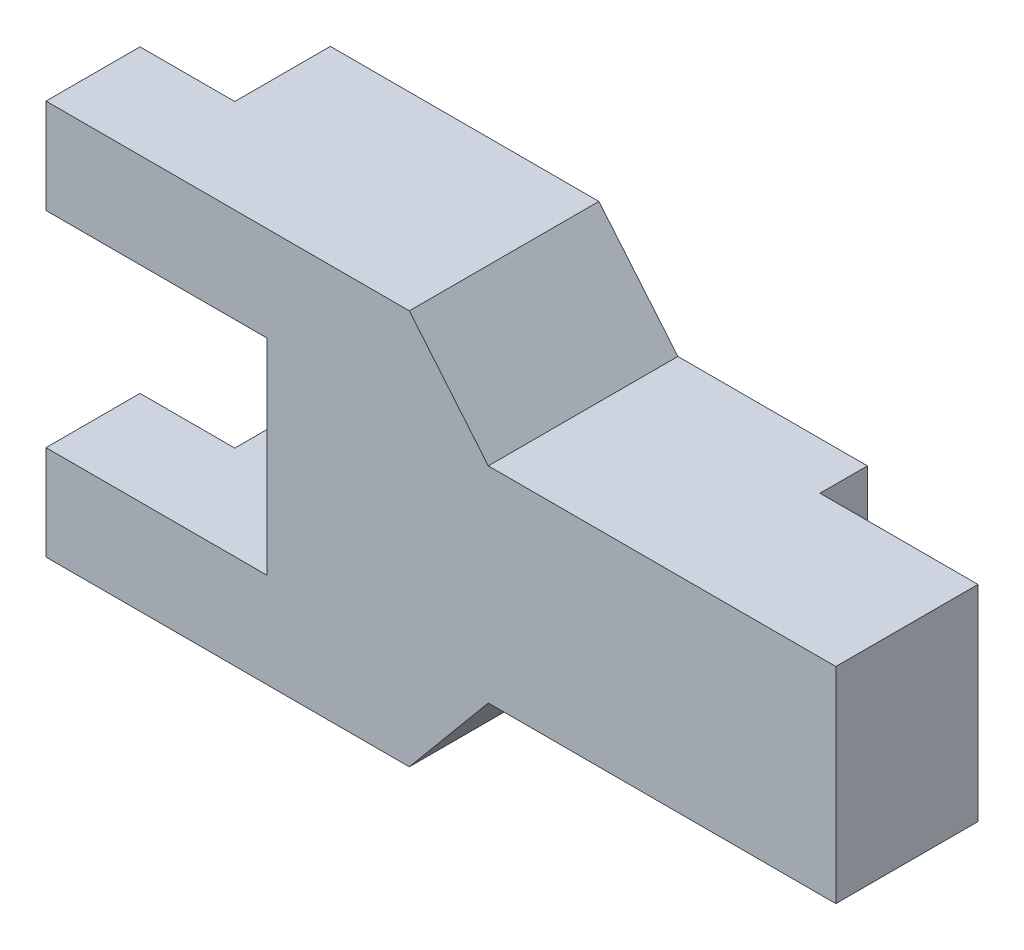
ISO-10303-21;
HEADER;
FILE_DESCRIPTION(('STEP AP214'),'2;1');
FILE_NAME('part.step','',(''),(''),'','','');
FILE_SCHEMA(('AUTOMOTIVE_DESIGN { 1 0 10303 214 1 1 1 1 }'));
ENDSEC;
DATA;
#1=APPLICATION_CONTEXT('core data for automotive mechanical design processes');
#2=APPLICATION_PROTOCOL_DEFINITION('international standard','automotive_design',2000,#1);
#3=PRODUCT_CONTEXT('',#1,'mechanical');
#4=PRODUCT('Part','Part','',(#3));
#5=PRODUCT_RELATED_PRODUCT_CATEGORY('part','',(#4));
#6=PRODUCT_DEFINITION_FORMATION('','',#4);
#7=PRODUCT_DEFINITION_CONTEXT('part definition',#1,'design');
#8=PRODUCT_DEFINITION('design','',#6,#7);
#9=PRODUCT_DEFINITION_SHAPE('','',#8);
#10=(LENGTH_UNIT() NAMED_UNIT(*) SI_UNIT(.MILLI.,.METRE.));
#11=(NAMED_UNIT(*) PLANE_ANGLE_UNIT() SI_UNIT($,.RADIAN.));
#12=(NAMED_UNIT(*) SI_UNIT($,.STERADIAN.) SOLID_ANGLE_UNIT());
#13=UNCERTAINTY_MEASURE_WITH_UNIT(LENGTH_MEASURE(1.E-05),#10,'distance_accuracy_value','');
#14=(GEOMETRIC_REPRESENTATION_CONTEXT(3) GLOBAL_UNCERTAINTY_ASSIGNED_CONTEXT((#13)) GLOBAL_UNIT_ASSIGNED_CONTEXT((#10,
#11,#12)) REPRESENTATION_CONTEXT('',''));
#15=CARTESIAN_POINT('',(0.,0.,0.));
#16=DIRECTION('',(0.,0.,1.));
#17=DIRECTION('',(1.,0.,0.));
#18=AXIS2_PLACEMENT_3D('',#15,#16,#17);
#19=CARTESIAN_POINT('',(-1654.77614905114,1083.80606669993,609.6));
#20=DIRECTION('',(0.,-1.,0.));
#21=DIRECTION('',(0.,0.,-1.));
#22=AXIS2_PLACEMENT_3D('',#19,#20,#21);
#23=PLANE('',#22);
#24=DIRECTION('',(0.,0.,-1.));
#25=VECTOR('',#24,1.);
#26=CARTESIAN_POINT('',(-2518.37614905114,1083.80606669993,307.34));
#27=LINE('',#26,#25);
#28=CARTESIAN_POINT('',(-2518.37614905114,1083.80606669993,307.34));
#29=VERTEX_POINT('',#28);
#30=CARTESIAN_POINT('',(-2518.37614905114,1083.80606669993,0.));
#31=VERTEX_POINT('',#30);
#32=EDGE_CURVE('E61',#29,#31,#27,.T.);
#33=ORIENTED_EDGE('',*,*,#32,.F.);
#34=DIRECTION('',(1.,0.,0.));
#35=VECTOR('',#34,1.);
#36=CARTESIAN_POINT('',(-2823.17614905114,1083.80606669993,307.34));
#37=LINE('',#36,#35);
#38=CARTESIAN_POINT('',(-2823.17614905114,1083.80606669993,307.34));
#39=VERTEX_POINT('',#38);
#40=EDGE_CURVE('E178',#39,#29,#37,.T.);
#41=ORIENTED_EDGE('',*,*,#40,.F.);
#42=DIRECTION('',(0.,0.,-1.));
#43=VECTOR('',#42,1.);
#44=CARTESIAN_POINT('',(-2823.17614905114,1083.80606669993,609.6));
#45=LINE('',#44,#43);
#46=CARTESIAN_POINT('',(-2823.17614905114,1083.80606669993,609.6));
#47=VERTEX_POINT('',#46);
#48=EDGE_CURVE('E346',#47,#39,#45,.T.);
#49=ORIENTED_EDGE('',*,*,#48,.F.);
#50=DIRECTION('',(-1.,0.,0.));
#51=VECTOR('',#50,1.);
#52=CARTESIAN_POINT('',(-1654.77614905114,1083.80606669993,609.6));
#53=LINE('',#52,#51);
#54=CARTESIAN_POINT('',(-1654.77614905114,1083.80606669993,609.6));
#55=VERTEX_POINT('',#54);
#56=EDGE_CURVE('E261',#55,#47,#53,.T.);
#57=ORIENTED_EDGE('',*,*,#56,.F.);
#58=DIRECTION('',(0.,0.,-1.));
#59=VECTOR('',#58,1.);
#60=CARTESIAN_POINT('',(-1654.77614905114,1083.80606669993,609.6));
#61=LINE('',#60,#59);
#62=CARTESIAN_POINT('',(-1654.77614905114,1083.80606669993,0.));
#63=VERTEX_POINT('',#62);
#64=EDGE_CURVE('E349',#55,#63,#61,.T.);
#65=ORIENTED_EDGE('',*,*,#64,.T.);
#66=DIRECTION('',(-1.,0.,0.));
#67=VECTOR('',#66,1.);
#68=CARTESIAN_POINT('',(-1654.77614905114,1083.80606669993,0.));
#69=LINE('',#68,#67);
#70=EDGE_CURVE('E193',#63,#31,#69,.T.);
#71=ORIENTED_EDGE('',*,*,#70,.T.);
#72=EDGE_LOOP('',(#33,#41,#49,#57,#65,#71));
#73=FACE_BOUND('',#72,.T.);
#74=ADVANCED_FACE('F45',(#73),#23,.F.);
#75=CARTESIAN_POINT('',(-2823.17614905114,779.006066699927,609.6));
#76=DIRECTION('',(0.,1.,0.));
#77=DIRECTION('',(-1.,0.,0.));
#78=AXIS2_PLACEMENT_3D('',#75,#76,#77);
#79=PLANE('',#78);
#80=DIRECTION('',(0.,0.,-1.));
#81=VECTOR('',#80,1.);
#82=CARTESIAN_POINT('',(-2518.37614905114,779.006066699927,307.34));
#83=LINE('',#82,#81);
#84=CARTESIAN_POINT('',(-2518.37614905114,779.006066699927,307.34));
#85=VERTEX_POINT('',#84);
#86=CARTESIAN_POINT('',(-2518.37614905114,779.006066699927,0.));
#87=VERTEX_POINT('',#86);
#88=EDGE_CURVE('E173',#85,#87,#83,.T.);
#89=ORIENTED_EDGE('',*,*,#88,.T.);
#90=DIRECTION('',(1.,0.,0.));
#91=VECTOR('',#90,1.);
#92=CARTESIAN_POINT('',(-2823.17614905114,779.006066699927,0.));
#93=LINE('',#92,#91);
#94=CARTESIAN_POINT('',(-2111.97614905114,779.006066699927,0.));
#95=VERTEX_POINT('',#94);
#96=EDGE_CURVE('E296',#87,#95,#93,.T.);
#97=ORIENTED_EDGE('',*,*,#96,.T.);
#98=DIRECTION('',(0.,0.,-1.));
#99=VECTOR('',#98,1.);
#100=CARTESIAN_POINT('',(-2111.97614905114,779.006066699927,609.6));
#101=LINE('',#100,#99);
#102=CARTESIAN_POINT('',(-2111.97614905114,779.006066699927,609.6));
#103=VERTEX_POINT('',#102);
#104=EDGE_CURVE('E338',#103,#95,#101,.T.);
#105=ORIENTED_EDGE('',*,*,#104,.F.);
#106=DIRECTION('',(1.,0.,0.));
#107=VECTOR('',#106,1.);
#108=CARTESIAN_POINT('',(-2823.17614905114,779.006066699927,609.6));
#109=LINE('',#108,#107);
#110=CARTESIAN_POINT('',(-2823.17614905114,779.006066699927,609.6));
#111=VERTEX_POINT('',#110);
#112=EDGE_CURVE('E267',#111,#103,#109,.T.);
#113=ORIENTED_EDGE('',*,*,#112,.F.);
#114=DIRECTION('',(0.,0.,-1.));
#115=VECTOR('',#114,1.);
#116=CARTESIAN_POINT('',(-2823.17614905114,779.006066699927,609.6));
#117=LINE('',#116,#115);
#118=CARTESIAN_POINT('',(-2823.17614905114,779.006066699927,307.34));
#119=VERTEX_POINT('',#118);
#120=EDGE_CURVE('E342',#111,#119,#117,.T.);
#121=ORIENTED_EDGE('',*,*,#120,.T.);
#122=DIRECTION('',(1.,0.,0.));
#123=VECTOR('',#122,1.);
#124=CARTESIAN_POINT('',(-2823.17614905114,779.006066699927,307.34));
#125=LINE('',#124,#123);
#126=EDGE_CURVE('E177',#119,#85,#125,.T.);
#127=ORIENTED_EDGE('',*,*,#126,.T.);
#128=EDGE_LOOP('',(#89,#97,#105,#113,#121,#127));
#129=FACE_BOUND('',#128,.T.);
#130=ADVANCED_FACE('F370',(#129),#79,.F.);
#131=CARTESIAN_POINT('',(-2111.97614905114,118.606066699927,609.6));
#132=DIRECTION('',(0.,-1.,0.));
#133=DIRECTION('',(1.,0.,0.));
#134=AXIS2_PLACEMENT_3D('',#131,#132,#133);
#135=PLANE('',#134);
#136=DIRECTION('',(0.,0.,-1.));
#137=VECTOR('',#136,1.);
#138=CARTESIAN_POINT('',(-2518.37614905114,118.606066699927,307.34));
#139=LINE('',#138,#137);
#140=CARTESIAN_POINT('',(-2518.37614905114,118.606066699927,307.34));
#141=VERTEX_POINT('',#140);
#142=CARTESIAN_POINT('',(-2518.37614905114,118.606066699927,0.));
#143=VERTEX_POINT('',#142);
#144=EDGE_CURVE('E69',#141,#143,#139,.T.);
#145=ORIENTED_EDGE('',*,*,#144,.F.);
#146=DIRECTION('',(1.,0.,0.));
#147=VECTOR('',#146,1.);
#148=CARTESIAN_POINT('',(-2823.17614905114,118.606066699927,307.34));
#149=LINE('',#148,#147);
#150=CARTESIAN_POINT('',(-2823.17614905114,118.606066699927,307.34));
#151=VERTEX_POINT('',#150);
#152=EDGE_CURVE('E213',#151,#141,#149,.T.);
#153=ORIENTED_EDGE('',*,*,#152,.F.);
#154=DIRECTION('',(0.,0.,-1.));
#155=VECTOR('',#154,1.);
#156=CARTESIAN_POINT('',(-2823.17614905114,118.606066699927,609.6));
#157=LINE('',#156,#155);
#158=CARTESIAN_POINT('',(-2823.17614905114,118.606066699927,609.6));
#159=VERTEX_POINT('',#158);
#160=EDGE_CURVE('E330',#159,#151,#157,.T.);
#161=ORIENTED_EDGE('',*,*,#160,.F.);
#162=DIRECTION('',(-1.,0.,0.));
#163=VECTOR('',#162,1.);
#164=CARTESIAN_POINT('',(-2111.97614905114,118.606066699927,609.6));
#165=LINE('',#164,#163);
#166=CARTESIAN_POINT('',(-2111.97614905114,118.606066699927,609.6));
#167=VERTEX_POINT('',#166);
#168=EDGE_CURVE('E273',#167,#159,#165,.T.);
#169=ORIENTED_EDGE('',*,*,#168,.F.);
#170=DIRECTION('',(0.,0.,-1.));
#171=VECTOR('',#170,1.);
#172=CARTESIAN_POINT('',(-2111.97614905114,118.606066699927,609.6));
#173=LINE('',#172,#171);
#174=CARTESIAN_POINT('',(-2111.97614905114,118.606066699927,0.));
#175=VERTEX_POINT('',#174);
#176=EDGE_CURVE('E334',#167,#175,#173,.T.);
#177=ORIENTED_EDGE('',*,*,#176,.T.);
#178=DIRECTION('',(-1.,0.,0.));
#179=VECTOR('',#178,1.);
#180=CARTESIAN_POINT('',(-2111.97614905114,118.606066699927,0.));
#181=LINE('',#180,#179);
#182=EDGE_CURVE('E302',#175,#143,#181,.T.);
#183=ORIENTED_EDGE('',*,*,#182,.T.);
#184=EDGE_LOOP('',(#145,#153,#161,#169,#177,#183));
#185=FACE_BOUND('',#184,.T.);
#186=ADVANCED_FACE('F416',(#185),#135,.F.);
#187=CARTESIAN_POINT('',(-2823.17614905114,-186.193933300073,609.6));
#188=DIRECTION('',(0.,1.,0.));
#189=DIRECTION('',(-1.,0.,0.));
#190=AXIS2_PLACEMENT_3D('',#187,#188,#189);
#191=PLANE('',#190);
#192=DIRECTION('',(0.,0.,-1.));
#193=VECTOR('',#192,1.);
#194=CARTESIAN_POINT('',(-2518.37614905114,-186.193933300073,307.34));
#195=LINE('',#194,#193);
#196=CARTESIAN_POINT('',(-2518.37614905114,-186.193933300073,307.34));
#197=VERTEX_POINT('',#196);
#198=CARTESIAN_POINT('',(-2518.37614905114,-186.193933300073,0.));
#199=VERTEX_POINT('',#198);
#200=EDGE_CURVE('E206',#197,#199,#195,.T.);
#201=ORIENTED_EDGE('',*,*,#200,.T.);
#202=DIRECTION('',(1.,0.,0.));
#203=VECTOR('',#202,1.);
#204=CARTESIAN_POINT('',(-2823.17614905114,-186.193933300073,0.));
#205=LINE('',#204,#203);
#206=CARTESIAN_POINT('',(-1654.77614905114,-186.193933300073,0.));
#207=VERTEX_POINT('',#206);
#208=EDGE_CURVE('E306',#199,#207,#205,.T.);
#209=ORIENTED_EDGE('',*,*,#208,.T.);
#210=DIRECTION('',(0.,0.,-1.));
#211=VECTOR('',#210,1.);
#212=CARTESIAN_POINT('',(-1654.77614905114,-186.193933300073,609.6));
#213=LINE('',#212,#211);
#214=CARTESIAN_POINT('',(-1654.77614905114,-186.193933300073,609.6));
#215=VERTEX_POINT('',#214);
#216=EDGE_CURVE('E322',#215,#207,#213,.T.);
#217=ORIENTED_EDGE('',*,*,#216,.F.);
#218=DIRECTION('',(1.,0.,0.));
#219=VECTOR('',#218,1.);
#220=CARTESIAN_POINT('',(-2823.17614905114,-186.193933300073,609.6));
#221=LINE('',#220,#219);
#222=CARTESIAN_POINT('',(-2823.17614905114,-186.193933300073,609.6));
#223=VERTEX_POINT('',#222);
#224=EDGE_CURVE('E279',#223,#215,#221,.T.);
#225=ORIENTED_EDGE('',*,*,#224,.F.);
#226=DIRECTION('',(0.,0.,-1.));
#227=VECTOR('',#226,1.);
#228=CARTESIAN_POINT('',(-2823.17614905114,-186.193933300073,609.6));
#229=LINE('',#228,#227);
#230=CARTESIAN_POINT('',(-2823.17614905114,-186.193933300073,307.34));
#231=VERTEX_POINT('',#230);
#232=EDGE_CURVE('E326',#223,#231,#229,.T.);
#233=ORIENTED_EDGE('',*,*,#232,.T.);
#234=DIRECTION('',(1.,0.,0.));
#235=VECTOR('',#234,1.);
#236=CARTESIAN_POINT('',(-2823.17614905114,-186.193933300073,307.34));
#237=LINE('',#236,#235);
#238=EDGE_CURVE('E216',#231,#197,#237,.T.);
#239=ORIENTED_EDGE('',*,*,#238,.T.);
#240=EDGE_LOOP('',(#201,#209,#217,#225,#233,#239));
#241=FACE_BOUND('',#240,.T.);
#242=ADVANCED_FACE('F407',(#241),#191,.F.);
#243=CARTESIAN_POINT('',(0.,0.,0.));
#244=DIRECTION('',(0.,0.,1.));
#245=DIRECTION('',(1.,0.,0.));
#246=AXIS2_PLACEMENT_3D('',#243,#244,#245);
#247=PLANE('',#246);
#248=DIRECTION('',(0.,1.,0.));
#249=VECTOR('',#248,1.);
#250=CARTESIAN_POINT('',(-2518.37614905114,779.006066699927,0.));
#251=LINE('',#250,#249);
#252=EDGE_CURVE('E188',#87,#31,#251,.T.);
#253=ORIENTED_EDGE('',*,*,#252,.T.);
#254=ORIENTED_EDGE('',*,*,#70,.F.);
#255=DIRECTION('',(-0.640184399664479,0.768221279597377,0.));
#256=VECTOR('',#255,1.);
#257=CARTESIAN_POINT('',(-1400.77614905114,779.006066699928,0.));
#258=LINE('',#257,#256);
#259=CARTESIAN_POINT('',(-1400.77614905114,779.006066699928,0.));
#260=VERTEX_POINT('',#259);
#261=EDGE_CURVE('E291',#260,#63,#258,.T.);
#262=ORIENTED_EDGE('',*,*,#261,.F.);
#263=DIRECTION('',(-1.,0.,0.));
#264=VECTOR('',#263,1.);
#265=CARTESIAN_POINT('',(-283.176149051143,779.006066699928,0.));
#266=LINE('',#265,#264);
#267=CARTESIAN_POINT('',(-791.176149051142,779.006066699928,0.));
#268=VERTEX_POINT('',#267);
#269=EDGE_CURVE('E247',#268,#260,#266,.T.);
#270=ORIENTED_EDGE('',*,*,#269,.F.);
#271=DIRECTION('',(0.,1.,0.));
#272=VECTOR('',#271,1.);
#273=CARTESIAN_POINT('',(-791.176149051142,779.006066699928,0.));
#274=LINE('',#273,#272);
#275=CARTESIAN_POINT('',(-791.176149051143,118.606066699928,0.));
#276=VERTEX_POINT('',#275);
#277=EDGE_CURVE('E198',#276,#268,#274,.T.);
#278=ORIENTED_EDGE('',*,*,#277,.F.);
#279=DIRECTION('',(1.,0.,0.));
#280=VECTOR('',#279,1.);
#281=CARTESIAN_POINT('',(-1400.77614905114,118.606066699928,0.));
#282=LINE('',#281,#280);
#283=CARTESIAN_POINT('',(-1400.77614905114,118.606066699928,0.));
#284=VERTEX_POINT('',#283);
#285=EDGE_CURVE('E255',#284,#276,#282,.T.);
#286=ORIENTED_EDGE('',*,*,#285,.F.);
#287=DIRECTION('',(0.640184399664479,0.768221279597377,0.));
#288=VECTOR('',#287,1.);
#289=CARTESIAN_POINT('',(-1654.77614905114,-186.193933300073,0.));
#290=LINE('',#289,#288);
#291=EDGE_CURVE('E309',#207,#284,#290,.T.);
#292=ORIENTED_EDGE('',*,*,#291,.F.);
#293=ORIENTED_EDGE('',*,*,#208,.F.);
#294=DIRECTION('',(0.,1.,0.));
#295=VECTOR('',#294,1.);
#296=CARTESIAN_POINT('',(-2518.37614905114,-186.193933300073,0.));
#297=LINE('',#296,#295);
#298=EDGE_CURVE('E210',#199,#143,#297,.T.);
#299=ORIENTED_EDGE('',*,*,#298,.T.);
#300=ORIENTED_EDGE('',*,*,#182,.F.);
#301=DIRECTION('',(0.,-1.,0.));
#302=VECTOR('',#301,1.);
#303=CARTESIAN_POINT('',(-2111.97614905114,779.006066699927,0.));
#304=LINE('',#303,#302);
#305=EDGE_CURVE('E299',#95,#175,#304,.T.);
#306=ORIENTED_EDGE('',*,*,#305,.F.);
#307=ORIENTED_EDGE('',*,*,#96,.F.);
#308=EDGE_LOOP('',(#253,#254,#262,#270,#278,#286,#292,#293,#299,#300,#306,#307));
#309=FACE_BOUND('',#308,.T.);
#310=ADVANCED_FACE('F362',(#309),#247,.F.);
#311=CARTESIAN_POINT('',(-283.176149051143,118.606066699928,609.6));
#312=DIRECTION('',(-1.,0.,0.));
#313=DIRECTION('',(0.,0.,1.));
#314=AXIS2_PLACEMENT_3D('',#311,#312,#313);
#315=PLANE('',#314);
#316=DIRECTION('',(0.,-1.,0.));
#317=VECTOR('',#316,1.);
#318=CARTESIAN_POINT('',(-283.176149051143,779.006066699928,152.4));
#319=LINE('',#318,#317);
#320=CARTESIAN_POINT('',(-283.176149051143,779.006066699928,152.4));
#321=VERTEX_POINT('',#320);
#322=CARTESIAN_POINT('',(-283.176149051143,118.606066699928,152.4));
#323=VERTEX_POINT('',#322);
#324=EDGE_CURVE('E226',#321,#323,#319,.T.);
#325=ORIENTED_EDGE('',*,*,#324,.F.);
#326=DIRECTION('',(0.,0.,-1.));
#327=VECTOR('',#326,1.);
#328=CARTESIAN_POINT('',(-283.176149051143,779.006066699928,609.6));
#329=LINE('',#328,#327);
#330=CARTESIAN_POINT('',(-283.176149051143,779.006066699928,609.6));
#331=VERTEX_POINT('',#330);
#332=EDGE_CURVE('E11',#331,#321,#329,.T.);
#333=ORIENTED_EDGE('',*,*,#332,.F.);
#334=DIRECTION('',(0.,1.,0.));
#335=VECTOR('',#334,1.);
#336=CARTESIAN_POINT('',(-283.176149051143,118.606066699928,609.6));
#337=LINE('',#336,#335);
#338=CARTESIAN_POINT('',(-283.176149051143,118.606066699928,609.6));
#339=VERTEX_POINT('',#338);
#340=EDGE_CURVE('E250',#339,#331,#337,.T.);
#341=ORIENTED_EDGE('',*,*,#340,.F.);
#342=DIRECTION('',(0.,0.,-1.));
#343=VECTOR('',#342,1.);
#344=CARTESIAN_POINT('',(-283.176149051143,118.606066699928,609.6));
#345=LINE('',#344,#343);
#346=EDGE_CURVE('E288',#339,#323,#345,.T.);
#347=ORIENTED_EDGE('',*,*,#346,.T.);
#348=EDGE_LOOP('',(#325,#333,#341,#347));
#349=FACE_BOUND('',#348,.T.);
#350=ADVANCED_FACE('F47',(#349),#315,.F.);
#351=CARTESIAN_POINT('',(-283.176149051143,779.006066699928,609.6));
#352=DIRECTION('',(0.,-1.,0.));
#353=DIRECTION('',(1.,0.,0.));
#354=AXIS2_PLACEMENT_3D('',#351,#352,#353);
#355=PLANE('',#354);
#356=DIRECTION('',(1.,0.,0.));
#357=VECTOR('',#356,1.);
#358=CARTESIAN_POINT('',(-283.176149051143,779.006066699928,152.4));
#359=LINE('',#358,#357);
#360=CARTESIAN_POINT('',(-791.176149051142,779.006066699928,152.4));
#361=VERTEX_POINT('',#360);
#362=EDGE_CURVE('E237',#361,#321,#359,.T.);
#363=ORIENTED_EDGE('',*,*,#362,.F.);
#364=DIRECTION('',(0.,0.,-1.));
#365=VECTOR('',#364,1.);
#366=CARTESIAN_POINT('',(-791.176149051142,779.006066699928,152.4));
#367=LINE('',#366,#365);
#368=EDGE_CURVE('E243',#361,#268,#367,.T.);
#369=ORIENTED_EDGE('',*,*,#368,.T.);
#370=ORIENTED_EDGE('',*,*,#269,.T.);
#371=DIRECTION('',(0.,0.,-1.));
#372=VECTOR('',#371,1.);
#373=CARTESIAN_POINT('',(-1400.77614905114,779.006066699928,609.6));
#374=LINE('',#373,#372);
#375=CARTESIAN_POINT('',(-1400.77614905114,779.006066699928,609.6));
#376=VERTEX_POINT('',#375);
#377=EDGE_CURVE('E54',#376,#260,#374,.T.);
#378=ORIENTED_EDGE('',*,*,#377,.F.);
#379=DIRECTION('',(-1.,0.,0.));
#380=VECTOR('',#379,1.);
#381=CARTESIAN_POINT('',(-283.176149051143,779.006066699928,609.6));
#382=LINE('',#381,#380);
#383=EDGE_CURVE('E254',#331,#376,#382,.T.);
#384=ORIENTED_EDGE('',*,*,#383,.F.);
#385=ORIENTED_EDGE('',*,*,#332,.T.);
#386=EDGE_LOOP('',(#363,#369,#370,#378,#384,#385));
#387=FACE_BOUND('',#386,.T.);
#388=ADVANCED_FACE('F382',(#387),#355,.F.);
#389=CARTESIAN_POINT('',(-1400.77614905114,779.006066699928,609.6));
#390=DIRECTION('',(-0.768221279597377,-0.640184399664479,0.));
#391=DIRECTION('',(0.640184399664479,-0.768221279597377,0.));
#392=AXIS2_PLACEMENT_3D('',#389,#390,#391);
#393=PLANE('',#392);
#394=ORIENTED_EDGE('',*,*,#261,.T.);
#395=ORIENTED_EDGE('',*,*,#64,.F.);
#396=DIRECTION('',(-0.640184399664479,0.768221279597377,0.));
#397=VECTOR('',#396,1.);
#398=CARTESIAN_POINT('',(-1400.77614905114,779.006066699928,609.6));
#399=LINE('',#398,#397);
#400=EDGE_CURVE('E258',#376,#55,#399,.T.);
#401=ORIENTED_EDGE('',*,*,#400,.F.);
#402=ORIENTED_EDGE('',*,*,#377,.T.);
#403=EDGE_LOOP('',(#394,#395,#401,#402));
#404=FACE_BOUND('',#403,.T.);
#405=ADVANCED_FACE('F357',(#404),#393,.F.);
#406=CARTESIAN_POINT('',(-2823.17614905114,1083.80606669993,609.6));
#407=DIRECTION('',(1.,0.,0.));
#408=DIRECTION('',(0.,1.,0.));
#409=AXIS2_PLACEMENT_3D('',#406,#407,#408);
#410=PLANE('',#409);
#411=ORIENTED_EDGE('',*,*,#48,.T.);
#412=DIRECTION('',(0.,1.,0.));
#413=VECTOR('',#412,1.);
#414=CARTESIAN_POINT('',(-2823.17614905114,779.006066699927,307.34));
#415=LINE('',#414,#413);
#416=EDGE_CURVE('E183',#119,#39,#415,.T.);
#417=ORIENTED_EDGE('',*,*,#416,.F.);
#418=ORIENTED_EDGE('',*,*,#120,.F.);
#419=DIRECTION('',(0.,-1.,0.));
#420=VECTOR('',#419,1.);
#421=CARTESIAN_POINT('',(-2823.17614905114,1083.80606669993,609.6));
#422=LINE('',#421,#420);
#423=EDGE_CURVE('E264',#47,#111,#422,.T.);
#424=ORIENTED_EDGE('',*,*,#423,.F.);
#425=EDGE_LOOP('',(#411,#417,#418,#424));
#426=FACE_BOUND('',#425,.T.);
#427=ADVANCED_FACE('F374',(#426),#410,.F.);
#428=CARTESIAN_POINT('',(-2111.97614905114,779.006066699927,609.6));
#429=DIRECTION('',(1.,0.,0.));
#430=DIRECTION('',(0.,0.,-1.));
#431=AXIS2_PLACEMENT_3D('',#428,#429,#430);
#432=PLANE('',#431);
#433=ORIENTED_EDGE('',*,*,#305,.T.);
#434=ORIENTED_EDGE('',*,*,#176,.F.);
#435=DIRECTION('',(0.,-1.,0.));
#436=VECTOR('',#435,1.);
#437=CARTESIAN_POINT('',(-2111.97614905114,779.006066699927,609.6));
#438=LINE('',#437,#436);
#439=EDGE_CURVE('E270',#103,#167,#438,.T.);
#440=ORIENTED_EDGE('',*,*,#439,.F.);
#441=ORIENTED_EDGE('',*,*,#104,.T.);
#442=EDGE_LOOP('',(#433,#434,#440,#441));
#443=FACE_BOUND('',#442,.T.);
#444=ADVANCED_FACE('F421',(#443),#432,.F.);
#445=CARTESIAN_POINT('',(-2823.17614905114,118.606066699927,609.6));
#446=DIRECTION('',(1.,0.,0.));
#447=DIRECTION('',(0.,1.,0.));
#448=AXIS2_PLACEMENT_3D('',#445,#446,#447);
#449=PLANE('',#448);
#450=ORIENTED_EDGE('',*,*,#160,.T.);
#451=DIRECTION('',(0.,1.,0.));
#452=VECTOR('',#451,1.);
#453=CARTESIAN_POINT('',(-2823.17614905114,-186.193933300073,307.34));
#454=LINE('',#453,#452);
#455=EDGE_CURVE('E205',#231,#151,#454,.T.);
#456=ORIENTED_EDGE('',*,*,#455,.F.);
#457=ORIENTED_EDGE('',*,*,#232,.F.);
#458=DIRECTION('',(0.,-1.,0.));
#459=VECTOR('',#458,1.);
#460=CARTESIAN_POINT('',(-2823.17614905114,118.606066699927,609.6));
#461=LINE('',#460,#459);
#462=EDGE_CURVE('E276',#159,#223,#461,.T.);
#463=ORIENTED_EDGE('',*,*,#462,.F.);
#464=EDGE_LOOP('',(#450,#456,#457,#463));
#465=FACE_BOUND('',#464,.T.);
#466=ADVANCED_FACE('F425',(#465),#449,.F.);
#467=CARTESIAN_POINT('',(-1654.77614905114,-186.193933300073,609.6));
#468=DIRECTION('',(-0.768221279597377,0.640184399664479,0.));
#469=DIRECTION('',(-0.640184399664479,-0.768221279597377,0.));
#470=AXIS2_PLACEMENT_3D('',#467,#468,#469);
#471=PLANE('',#470);
#472=ORIENTED_EDGE('',*,*,#291,.T.);
#473=DIRECTION('',(0.,0.,-1.));
#474=VECTOR('',#473,1.);
#475=CARTESIAN_POINT('',(-1400.77614905114,118.606066699928,609.6));
#476=LINE('',#475,#474);
#477=CARTESIAN_POINT('',(-1400.77614905114,118.606066699928,609.6));
#478=VERTEX_POINT('',#477);
#479=EDGE_CURVE('E318',#478,#284,#476,.T.);
#480=ORIENTED_EDGE('',*,*,#479,.F.);
#481=DIRECTION('',(0.640184399664479,0.768221279597377,0.));
#482=VECTOR('',#481,1.);
#483=CARTESIAN_POINT('',(-1654.77614905114,-186.193933300073,609.6));
#484=LINE('',#483,#482);
#485=EDGE_CURVE('E282',#215,#478,#484,.T.);
#486=ORIENTED_EDGE('',*,*,#485,.F.);
#487=ORIENTED_EDGE('',*,*,#216,.T.);
#488=EDGE_LOOP('',(#472,#480,#486,#487));
#489=FACE_BOUND('',#488,.T.);
#490=ADVANCED_FACE('F400',(#489),#471,.F.);
#491=CARTESIAN_POINT('',(-1400.77614905114,118.606066699928,609.6));
#492=DIRECTION('',(0.,1.,0.));
#493=DIRECTION('',(0.,0.,1.));
#494=AXIS2_PLACEMENT_3D('',#491,#492,#493);
#495=PLANE('',#494);
#496=ORIENTED_EDGE('',*,*,#285,.T.);
#497=DIRECTION('',(0.,0.,-1.));
#498=VECTOR('',#497,1.);
#499=CARTESIAN_POINT('',(-791.176149051143,118.606066699928,152.4));
#500=LINE('',#499,#498);
#501=CARTESIAN_POINT('',(-791.176149051143,118.606066699928,152.4));
#502=VERTEX_POINT('',#501);
#503=EDGE_CURVE('E240',#502,#276,#500,.T.);
#504=ORIENTED_EDGE('',*,*,#503,.F.);
#505=DIRECTION('',(-1.,0.,0.));
#506=VECTOR('',#505,1.);
#507=CARTESIAN_POINT('',(-283.176149051143,118.606066699928,152.4));
#508=LINE('',#507,#506);
#509=EDGE_CURVE('E229',#323,#502,#508,.T.);
#510=ORIENTED_EDGE('',*,*,#509,.F.);
#511=ORIENTED_EDGE('',*,*,#346,.F.);
#512=DIRECTION('',(1.,0.,0.));
#513=VECTOR('',#512,1.);
#514=CARTESIAN_POINT('',(-1400.77614905114,118.606066699928,609.6));
#515=LINE('',#514,#513);
#516=EDGE_CURVE('E285',#478,#339,#515,.T.);
#517=ORIENTED_EDGE('',*,*,#516,.F.);
#518=ORIENTED_EDGE('',*,*,#479,.T.);
#519=EDGE_LOOP('',(#496,#504,#510,#511,#517,#518));
#520=FACE_BOUND('',#519,.T.);
#521=ADVANCED_FACE('F391',(#520),#495,.F.);
#522=CARTESIAN_POINT('',(0.,0.,609.6));
#523=DIRECTION('',(0.,0.,1.));
#524=DIRECTION('',(1.,0.,0.));
#525=AXIS2_PLACEMENT_3D('',#522,#523,#524);
#526=PLANE('',#525);
#527=ORIENTED_EDGE('',*,*,#340,.T.);
#528=ORIENTED_EDGE('',*,*,#383,.T.);
#529=ORIENTED_EDGE('',*,*,#400,.T.);
#530=ORIENTED_EDGE('',*,*,#56,.T.);
#531=ORIENTED_EDGE('',*,*,#423,.T.);
#532=ORIENTED_EDGE('',*,*,#112,.T.);
#533=ORIENTED_EDGE('',*,*,#439,.T.);
#534=ORIENTED_EDGE('',*,*,#168,.T.);
#535=ORIENTED_EDGE('',*,*,#462,.T.);
#536=ORIENTED_EDGE('',*,*,#224,.T.);
#537=ORIENTED_EDGE('',*,*,#485,.T.);
#538=ORIENTED_EDGE('',*,*,#516,.T.);
#539=EDGE_LOOP('',(#527,#528,#529,#530,#531,#532,#533,#534,#535,#536,#537,#538));
#540=FACE_BOUND('',#539,.T.);
#541=ADVANCED_FACE('F378',(#540),#526,.T.);
#542=CARTESIAN_POINT('',(-791.176149051142,779.006066699928,152.4));
#543=DIRECTION('',(-1.,0.,0.));
#544=DIRECTION('',(0.,-1.,0.));
#545=AXIS2_PLACEMENT_3D('',#542,#543,#544);
#546=PLANE('',#545);
#547=ORIENTED_EDGE('',*,*,#277,.T.);
#548=ORIENTED_EDGE('',*,*,#368,.F.);
#549=DIRECTION('',(0.,1.,0.));
#550=VECTOR('',#549,1.);
#551=CARTESIAN_POINT('',(-791.176149051142,779.006066699928,152.4));
#552=LINE('',#551,#550);
#553=EDGE_CURVE('E233',#502,#361,#552,.T.);
#554=ORIENTED_EDGE('',*,*,#553,.F.);
#555=ORIENTED_EDGE('',*,*,#503,.T.);
#556=EDGE_LOOP('',(#547,#548,#554,#555));
#557=FACE_BOUND('',#556,.T.);
#558=ADVANCED_FACE('F395',(#557),#546,.F.);
#559=CARTESIAN_POINT('',(0.,0.,152.4));
#560=DIRECTION('',(0.,0.,-1.));
#561=DIRECTION('',(-1.,0.,0.));
#562=AXIS2_PLACEMENT_3D('',#559,#560,#561);
#563=PLANE('',#562);
#564=ORIENTED_EDGE('',*,*,#324,.T.);
#565=ORIENTED_EDGE('',*,*,#509,.T.);
#566=ORIENTED_EDGE('',*,*,#553,.T.);
#567=ORIENTED_EDGE('',*,*,#362,.T.);
#568=EDGE_LOOP('',(#564,#565,#566,#567));
#569=FACE_BOUND('',#568,.T.);
#570=ADVANCED_FACE('F388',(#569),#563,.T.);
#571=CARTESIAN_POINT('',(-2518.37614905114,-186.193933300073,307.34));
#572=DIRECTION('',(-1.,0.,0.));
#573=DIRECTION('',(0.,0.,1.));
#574=AXIS2_PLACEMENT_3D('',#571,#572,#573);
#575=PLANE('',#574);
#576=ORIENTED_EDGE('',*,*,#298,.F.);
#577=ORIENTED_EDGE('',*,*,#200,.F.);
#578=DIRECTION('',(0.,1.,0.));
#579=VECTOR('',#578,1.);
#580=CARTESIAN_POINT('',(-2518.37614905114,-186.193933300073,307.34));
#581=LINE('',#580,#579);
#582=EDGE_CURVE('E220',#197,#141,#581,.T.);
#583=ORIENTED_EDGE('',*,*,#582,.T.);
#584=ORIENTED_EDGE('',*,*,#144,.T.);
#585=EDGE_LOOP('',(#576,#577,#583,#584));
#586=FACE_BOUND('',#585,.T.);
#587=ADVANCED_FACE('F409',(#586),#575,.T.);
#588=CARTESIAN_POINT('',(0.,0.,307.34));
#589=DIRECTION('',(0.,0.,1.));
#590=DIRECTION('',(1.,0.,0.));
#591=AXIS2_PLACEMENT_3D('',#588,#589,#590);
#592=PLANE('',#591);
#593=ORIENTED_EDGE('',*,*,#152,.T.);
#594=ORIENTED_EDGE('',*,*,#582,.F.);
#595=ORIENTED_EDGE('',*,*,#238,.F.);
#596=ORIENTED_EDGE('',*,*,#455,.T.);
#597=EDGE_LOOP('',(#593,#594,#595,#596));
#598=FACE_BOUND('',#597,.T.);
#599=ADVANCED_FACE('F411',(#598),#592,.F.);
#600=CARTESIAN_POINT('',(-2518.37614905114,779.006066699927,307.34));
#601=DIRECTION('',(-1.,0.,0.));
#602=DIRECTION('',(0.,0.,1.));
#603=AXIS2_PLACEMENT_3D('',#600,#601,#602);
#604=PLANE('',#603);
#605=ORIENTED_EDGE('',*,*,#252,.F.);
#606=ORIENTED_EDGE('',*,*,#88,.F.);
#607=DIRECTION('',(0.,1.,0.));
#608=VECTOR('',#607,1.);
#609=CARTESIAN_POINT('',(-2518.37614905114,779.006066699927,307.34));
#610=LINE('',#609,#608);
#611=EDGE_CURVE('E169',#85,#29,#610,.T.);
#612=ORIENTED_EDGE('',*,*,#611,.T.);
#613=ORIENTED_EDGE('',*,*,#32,.T.);
#614=EDGE_LOOP('',(#605,#606,#612,#613));
#615=FACE_BOUND('',#614,.T.);
#616=ADVANCED_FACE('F171',(#615),#604,.T.);
#617=CARTESIAN_POINT('',(0.,0.,307.34));
#618=DIRECTION('',(0.,0.,1.));
#619=DIRECTION('',(1.,0.,0.));
#620=AXIS2_PLACEMENT_3D('',#617,#618,#619);
#621=PLANE('',#620);
#622=ORIENTED_EDGE('',*,*,#40,.T.);
#623=ORIENTED_EDGE('',*,*,#611,.F.);
#624=ORIENTED_EDGE('',*,*,#126,.F.);
#625=ORIENTED_EDGE('',*,*,#416,.T.);
#626=EDGE_LOOP('',(#622,#623,#624,#625));
#627=FACE_BOUND('',#626,.T.);
#628=ADVANCED_FACE('F181',(#627),#621,.F.);
#629=CLOSED_SHELL('',(#74,#130,#186,#242,#310,#350,#388,#405,#427,#444,#466,#490,#521,#541,#558,
#570,#587,#599,#616,#628));
#630=MANIFOLD_SOLID_BREP('B2',#629);
#631=ADVANCED_BREP_SHAPE_REPRESENTATION('',(#18,#630),#14);
#632=SHAPE_DEFINITION_REPRESENTATION(#9,#631);
ENDSEC;
END-ISO-10303-21;
